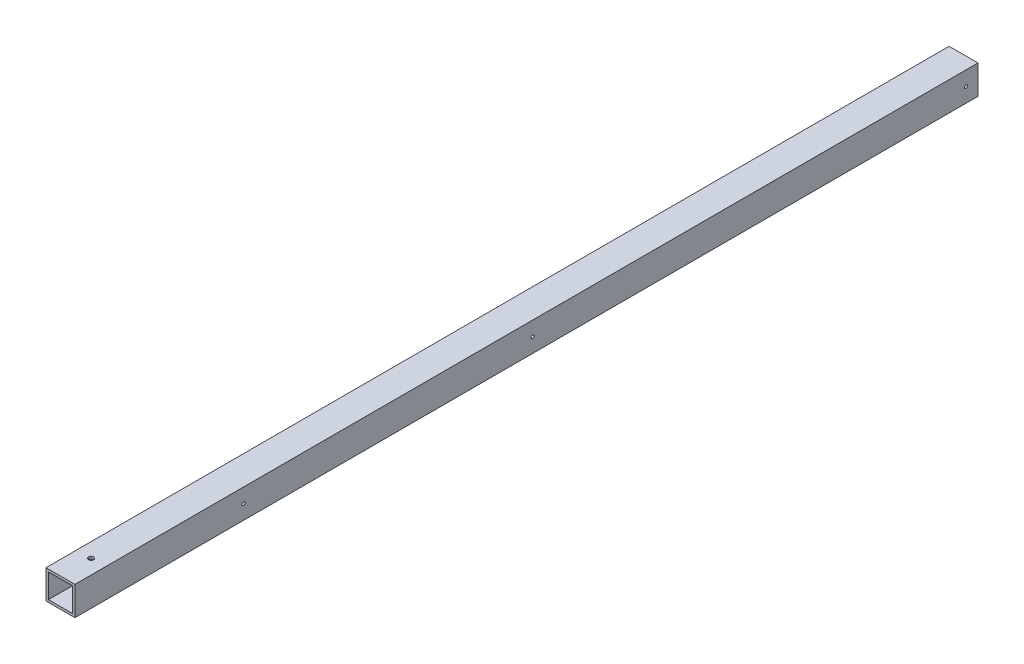
ISO-10303-21;
HEADER;
FILE_DESCRIPTION(('STEP AP214'),'2;1');
FILE_NAME('part.step','',(''),(''),'','','');
FILE_SCHEMA(('AUTOMOTIVE_DESIGN { 1 0 10303 214 1 1 1 1 }'));
ENDSEC;
DATA;
#1=APPLICATION_CONTEXT('core data for automotive mechanical design processes');
#2=APPLICATION_PROTOCOL_DEFINITION('international standard','automotive_design',2000,#1);
#3=PRODUCT_CONTEXT('',#1,'mechanical');
#4=PRODUCT('Part','Part','',(#3));
#5=PRODUCT_RELATED_PRODUCT_CATEGORY('part','',(#4));
#6=PRODUCT_DEFINITION_FORMATION('','',#4);
#7=PRODUCT_DEFINITION_CONTEXT('part definition',#1,'design');
#8=PRODUCT_DEFINITION('design','',#6,#7);
#9=PRODUCT_DEFINITION_SHAPE('','',#8);
#10=(LENGTH_UNIT() NAMED_UNIT(*) SI_UNIT(.MILLI.,.METRE.));
#11=(NAMED_UNIT(*) PLANE_ANGLE_UNIT() SI_UNIT($,.RADIAN.));
#12=(NAMED_UNIT(*) SI_UNIT($,.STERADIAN.) SOLID_ANGLE_UNIT());
#13=UNCERTAINTY_MEASURE_WITH_UNIT(LENGTH_MEASURE(1.E-05),#10,'distance_accuracy_value','');
#14=(GEOMETRIC_REPRESENTATION_CONTEXT(3) GLOBAL_UNCERTAINTY_ASSIGNED_CONTEXT((#13)) GLOBAL_UNIT_ASSIGNED_CONTEXT((#10,
#11,#12)) REPRESENTATION_CONTEXT('',''));
#15=CARTESIAN_POINT('',(0.,0.,0.));
#16=DIRECTION('',(0.,0.,1.));
#17=DIRECTION('',(1.,0.,0.));
#18=AXIS2_PLACEMENT_3D('',#15,#16,#17);
#19=CARTESIAN_POINT('',(0.,0.,375.));
#20=DIRECTION('',(0.,0.,1.));
#21=DIRECTION('',(1.,0.,0.));
#22=AXIS2_PLACEMENT_3D('',#19,#20,#21);
#23=PLANE('',#22);
#24=DIRECTION('',(0.,-1.,0.));
#25=VECTOR('',#24,1.);
#26=CARTESIAN_POINT('',(-12.,12.,375.));
#27=LINE('',#26,#25);
#28=CARTESIAN_POINT('',(-12.,12.,375.));
#29=VERTEX_POINT('',#28);
#30=CARTESIAN_POINT('',(-12.,-12.,375.));
#31=VERTEX_POINT('',#30);
#32=EDGE_CURVE('E140',#29,#31,#27,.T.);
#33=ORIENTED_EDGE('',*,*,#32,.T.);
#34=DIRECTION('',(1.,0.,0.));
#35=VECTOR('',#34,1.);
#36=CARTESIAN_POINT('',(-12.,-12.,375.));
#37=LINE('',#36,#35);
#38=CARTESIAN_POINT('',(12.,-12.,375.));
#39=VERTEX_POINT('',#38);
#40=EDGE_CURVE('E143',#31,#39,#37,.T.);
#41=ORIENTED_EDGE('',*,*,#40,.T.);
#42=DIRECTION('',(0.,1.,0.));
#43=VECTOR('',#42,1.);
#44=CARTESIAN_POINT('',(12.,12.,375.));
#45=LINE('',#44,#43);
#46=CARTESIAN_POINT('',(12.,12.,375.));
#47=VERTEX_POINT('',#46);
#48=EDGE_CURVE('E146',#39,#47,#45,.T.);
#49=ORIENTED_EDGE('',*,*,#48,.T.);
#50=DIRECTION('',(-1.,0.,0.));
#51=VECTOR('',#50,1.);
#52=CARTESIAN_POINT('',(-12.,12.,375.));
#53=LINE('',#52,#51);
#54=EDGE_CURVE('E148',#47,#29,#53,.T.);
#55=ORIENTED_EDGE('',*,*,#54,.T.);
#56=EDGE_LOOP('',(#33,#41,#49,#55));
#57=FACE_BOUND('',#56,.T.);
#58=DIRECTION('',(-1.,0.,0.));
#59=VECTOR('',#58,1.);
#60=CARTESIAN_POINT('',(-10.,10.,375.));
#61=LINE('',#60,#59);
#62=CARTESIAN_POINT('',(10.,10.,375.));
#63=VERTEX_POINT('',#62);
#64=CARTESIAN_POINT('',(-10.,10.,375.));
#65=VERTEX_POINT('',#64);
#66=EDGE_CURVE('E110',#63,#65,#61,.T.);
#67=ORIENTED_EDGE('',*,*,#66,.F.);
#68=DIRECTION('',(0.,1.,0.));
#69=VECTOR('',#68,1.);
#70=CARTESIAN_POINT('',(10.,10.,375.));
#71=LINE('',#70,#69);
#72=CARTESIAN_POINT('',(10.,-10.,375.));
#73=VERTEX_POINT('',#72);
#74=EDGE_CURVE('E102',#73,#63,#71,.T.);
#75=ORIENTED_EDGE('',*,*,#74,.F.);
#76=DIRECTION('',(1.,0.,0.));
#77=VECTOR('',#76,1.);
#78=CARTESIAN_POINT('',(-10.,-10.,375.));
#79=LINE('',#78,#77);
#80=CARTESIAN_POINT('',(-10.,-10.,375.));
#81=VERTEX_POINT('',#80);
#82=EDGE_CURVE('E124',#81,#73,#79,.T.);
#83=ORIENTED_EDGE('',*,*,#82,.F.);
#84=DIRECTION('',(0.,-1.,0.));
#85=VECTOR('',#84,1.);
#86=CARTESIAN_POINT('',(-10.,10.,375.));
#87=LINE('',#86,#85);
#88=EDGE_CURVE('E122',#65,#81,#87,.T.);
#89=ORIENTED_EDGE('',*,*,#88,.F.);
#90=EDGE_LOOP('',(#67,#75,#83,#89));
#91=FACE_BOUND('',#90,.T.);
#92=ADVANCED_FACE('F35',(#57,#91),#23,.T.);
#93=CARTESIAN_POINT('',(0.,0.,-375.));
#94=DIRECTION('',(0.,0.,1.));
#95=DIRECTION('',(1.,0.,0.));
#96=AXIS2_PLACEMENT_3D('',#93,#94,#95);
#97=PLANE('',#96);
#98=DIRECTION('',(0.,-1.,0.));
#99=VECTOR('',#98,1.);
#100=CARTESIAN_POINT('',(-12.,12.,-375.));
#101=LINE('',#100,#99);
#102=CARTESIAN_POINT('',(-12.,12.,-375.));
#103=VERTEX_POINT('',#102);
#104=CARTESIAN_POINT('',(-12.,-12.,-375.));
#105=VERTEX_POINT('',#104);
#106=EDGE_CURVE('E118',#103,#105,#101,.T.);
#107=ORIENTED_EDGE('',*,*,#106,.F.);
#108=DIRECTION('',(-1.,0.,0.));
#109=VECTOR('',#108,1.);
#110=CARTESIAN_POINT('',(-12.,12.,-375.));
#111=LINE('',#110,#109);
#112=CARTESIAN_POINT('',(12.,12.,-375.));
#113=VERTEX_POINT('',#112);
#114=EDGE_CURVE('E144',#113,#103,#111,.T.);
#115=ORIENTED_EDGE('',*,*,#114,.F.);
#116=DIRECTION('',(0.,1.,0.));
#117=VECTOR('',#116,1.);
#118=CARTESIAN_POINT('',(12.,12.,-375.));
#119=LINE('',#118,#117);
#120=CARTESIAN_POINT('',(12.,-12.,-375.));
#121=VERTEX_POINT('',#120);
#122=EDGE_CURVE('E155',#121,#113,#119,.T.);
#123=ORIENTED_EDGE('',*,*,#122,.F.);
#124=DIRECTION('',(1.,0.,0.));
#125=VECTOR('',#124,1.);
#126=CARTESIAN_POINT('',(-12.,-12.,-375.));
#127=LINE('',#126,#125);
#128=EDGE_CURVE('E153',#105,#121,#127,.T.);
#129=ORIENTED_EDGE('',*,*,#128,.F.);
#130=EDGE_LOOP('',(#107,#115,#123,#129));
#131=FACE_BOUND('',#130,.T.);
#132=DIRECTION('',(0.,1.,0.));
#133=VECTOR('',#132,1.);
#134=CARTESIAN_POINT('',(10.,10.,-375.));
#135=LINE('',#134,#133);
#136=CARTESIAN_POINT('',(10.,-10.,-375.));
#137=VERTEX_POINT('',#136);
#138=CARTESIAN_POINT('',(10.,10.,-375.));
#139=VERTEX_POINT('',#138);
#140=EDGE_CURVE('E60',#137,#139,#135,.T.);
#141=ORIENTED_EDGE('',*,*,#140,.T.);
#142=DIRECTION('',(-1.,0.,0.));
#143=VECTOR('',#142,1.);
#144=CARTESIAN_POINT('',(-10.,10.,-375.));
#145=LINE('',#144,#143);
#146=CARTESIAN_POINT('',(-10.,10.,-375.));
#147=VERTEX_POINT('',#146);
#148=EDGE_CURVE('E117',#139,#147,#145,.T.);
#149=ORIENTED_EDGE('',*,*,#148,.T.);
#150=DIRECTION('',(0.,-1.,0.));
#151=VECTOR('',#150,1.);
#152=CARTESIAN_POINT('',(-10.,10.,-375.));
#153=LINE('',#152,#151);
#154=CARTESIAN_POINT('',(-10.,-10.,-375.));
#155=VERTEX_POINT('',#154);
#156=EDGE_CURVE('E132',#147,#155,#153,.T.);
#157=ORIENTED_EDGE('',*,*,#156,.T.);
#158=DIRECTION('',(1.,0.,0.));
#159=VECTOR('',#158,1.);
#160=CARTESIAN_POINT('',(-10.,-10.,-375.));
#161=LINE('',#160,#159);
#162=EDGE_CURVE('E111',#155,#137,#161,.T.);
#163=ORIENTED_EDGE('',*,*,#162,.T.);
#164=EDGE_LOOP('',(#141,#149,#157,#163));
#165=FACE_BOUND('',#164,.T.);
#166=ADVANCED_FACE('F216',(#131,#165),#97,.F.);
#167=CARTESIAN_POINT('',(-12.,12.,375.));
#168=DIRECTION('',(1.,0.,0.));
#169=DIRECTION('',(0.,1.,0.));
#170=AXIS2_PLACEMENT_3D('',#167,#168,#169);
#171=PLANE('',#170);
#172=CARTESIAN_POINT('',(-12.,0.,-365.));
#173=DIRECTION('',(-1.,0.,0.));
#174=DIRECTION('',(0.,0.,1.));
#175=AXIS2_PLACEMENT_3D('',#172,#173,#174);
#176=CIRCLE('',#175,1.24999999999999);
#177=CARTESIAN_POINT('',(-12.,0.,-363.75));
#178=VERTEX_POINT('',#177);
#179=EDGE_CURVE('E285',#178,#178,#176,.T.);
#180=ORIENTED_EDGE('',*,*,#179,.F.);
#181=EDGE_LOOP('',(#180));
#182=FACE_BOUND('',#181,.T.);
#183=CARTESIAN_POINT('',(-12.,0.,-5.));
#184=DIRECTION('',(-1.,0.,0.));
#185=DIRECTION('',(0.,0.,1.));
#186=AXIS2_PLACEMENT_3D('',#183,#184,#185);
#187=CIRCLE('',#186,1.24999999999999);
#188=CARTESIAN_POINT('',(-12.,0.,-3.75000000000002));
#189=VERTEX_POINT('',#188);
#190=EDGE_CURVE('E178',#189,#189,#187,.T.);
#191=ORIENTED_EDGE('',*,*,#190,.F.);
#192=EDGE_LOOP('',(#191));
#193=FACE_BOUND('',#192,.T.);
#194=CARTESIAN_POINT('',(-12.,0.,235.));
#195=DIRECTION('',(-1.,0.,0.));
#196=DIRECTION('',(0.,0.,1.));
#197=AXIS2_PLACEMENT_3D('',#194,#195,#196);
#198=CIRCLE('',#197,1.24999999999999);
#199=CARTESIAN_POINT('',(-12.,0.,236.25));
#200=VERTEX_POINT('',#199);
#201=EDGE_CURVE('E175',#200,#200,#198,.T.);
#202=ORIENTED_EDGE('',*,*,#201,.F.);
#203=EDGE_LOOP('',(#202));
#204=FACE_BOUND('',#203,.T.);
#205=ORIENTED_EDGE('',*,*,#106,.T.);
#206=DIRECTION('',(0.,0.,-1.));
#207=VECTOR('',#206,1.);
#208=CARTESIAN_POINT('',(-12.,-12.,375.));
#209=LINE('',#208,#207);
#210=EDGE_CURVE('E11',#31,#105,#209,.T.);
#211=ORIENTED_EDGE('',*,*,#210,.F.);
#212=ORIENTED_EDGE('',*,*,#32,.F.);
#213=DIRECTION('',(0.,0.,-1.));
#214=VECTOR('',#213,1.);
#215=CARTESIAN_POINT('',(-12.,12.,375.));
#216=LINE('',#215,#214);
#217=EDGE_CURVE('E150',#29,#103,#216,.T.);
#218=ORIENTED_EDGE('',*,*,#217,.T.);
#219=EDGE_LOOP('',(#205,#211,#212,#218));
#220=FACE_BOUND('',#219,.T.);
#221=ADVANCED_FACE('F37',(#182,#193,#204,#220),#171,.F.);
#222=CARTESIAN_POINT('',(-12.,-12.,375.));
#223=DIRECTION('',(0.,1.,0.));
#224=DIRECTION('',(-1.,0.,0.));
#225=AXIS2_PLACEMENT_3D('',#222,#223,#224);
#226=PLANE('',#225);
#227=ORIENTED_EDGE('',*,*,#128,.T.);
#228=DIRECTION('',(0.,0.,-1.));
#229=VECTOR('',#228,1.);
#230=CARTESIAN_POINT('',(12.,-12.,375.));
#231=LINE('',#230,#229);
#232=EDGE_CURVE('E44',#39,#121,#231,.T.);
#233=ORIENTED_EDGE('',*,*,#232,.F.);
#234=ORIENTED_EDGE('',*,*,#40,.F.);
#235=ORIENTED_EDGE('',*,*,#210,.T.);
#236=EDGE_LOOP('',(#227,#233,#234,#235));
#237=FACE_BOUND('',#236,.T.);
#238=ADVANCED_FACE('F225',(#237),#226,.F.);
#239=CARTESIAN_POINT('',(12.,12.,375.));
#240=DIRECTION('',(-1.,0.,0.));
#241=DIRECTION('',(0.,-1.,0.));
#242=AXIS2_PLACEMENT_3D('',#239,#240,#241);
#243=PLANE('',#242);
#244=CARTESIAN_POINT('',(12.,0.,-365.));
#245=DIRECTION('',(-1.,0.,0.));
#246=DIRECTION('',(0.,0.,1.));
#247=AXIS2_PLACEMENT_3D('',#244,#245,#246);
#248=CIRCLE('',#247,1.24999999999998);
#249=CARTESIAN_POINT('',(12.,0.,-363.75));
#250=VERTEX_POINT('',#249);
#251=EDGE_CURVE('E290',#250,#250,#248,.T.);
#252=ORIENTED_EDGE('',*,*,#251,.T.);
#253=EDGE_LOOP('',(#252));
#254=FACE_BOUND('',#253,.T.);
#255=CARTESIAN_POINT('',(12.,0.,-5.));
#256=DIRECTION('',(-1.,0.,0.));
#257=DIRECTION('',(0.,0.,1.));
#258=AXIS2_PLACEMENT_3D('',#255,#256,#257);
#259=CIRCLE('',#258,1.24999999999998);
#260=CARTESIAN_POINT('',(12.,0.,-3.75000000000002));
#261=VERTEX_POINT('',#260);
#262=EDGE_CURVE('E171',#261,#261,#259,.T.);
#263=ORIENTED_EDGE('',*,*,#262,.T.);
#264=EDGE_LOOP('',(#263));
#265=FACE_BOUND('',#264,.T.);
#266=CARTESIAN_POINT('',(12.,0.,235.));
#267=DIRECTION('',(-1.,0.,0.));
#268=DIRECTION('',(0.,0.,1.));
#269=AXIS2_PLACEMENT_3D('',#266,#267,#268);
#270=CIRCLE('',#269,1.24999999999998);
#271=CARTESIAN_POINT('',(12.,0.,236.25));
#272=VERTEX_POINT('',#271);
#273=EDGE_CURVE('E167',#272,#272,#270,.T.);
#274=ORIENTED_EDGE('',*,*,#273,.T.);
#275=EDGE_LOOP('',(#274));
#276=FACE_BOUND('',#275,.T.);
#277=ORIENTED_EDGE('',*,*,#122,.T.);
#278=DIRECTION('',(0.,0.,-1.));
#279=VECTOR('',#278,1.);
#280=CARTESIAN_POINT('',(12.,12.,375.));
#281=LINE('',#280,#279);
#282=EDGE_CURVE('E160',#47,#113,#281,.T.);
#283=ORIENTED_EDGE('',*,*,#282,.F.);
#284=ORIENTED_EDGE('',*,*,#48,.F.);
#285=ORIENTED_EDGE('',*,*,#232,.T.);
#286=EDGE_LOOP('',(#277,#283,#284,#285));
#287=FACE_BOUND('',#286,.T.);
#288=ADVANCED_FACE('F209',(#254,#265,#276,#287),#243,.F.);
#289=CARTESIAN_POINT('',(-12.,12.,375.));
#290=DIRECTION('',(0.,-1.,0.));
#291=DIRECTION('',(0.,0.,-1.));
#292=AXIS2_PLACEMENT_3D('',#289,#290,#291);
#293=PLANE('',#292);
#294=CARTESIAN_POINT('',(0.,12.,349.5));
#295=DIRECTION('',(0.,1.,0.));
#296=DIRECTION('',(0.,0.,1.));
#297=AXIS2_PLACEMENT_3D('',#294,#295,#296);
#298=CIRCLE('',#297,2.1);
#299=CARTESIAN_POINT('',(0.,12.,351.6));
#300=VERTEX_POINT('',#299);
#301=EDGE_CURVE('E283',#300,#300,#298,.T.);
#302=ORIENTED_EDGE('',*,*,#301,.F.);
#303=EDGE_LOOP('',(#302));
#304=FACE_BOUND('',#303,.T.);
#305=ORIENTED_EDGE('',*,*,#114,.T.);
#306=ORIENTED_EDGE('',*,*,#217,.F.);
#307=ORIENTED_EDGE('',*,*,#54,.F.);
#308=ORIENTED_EDGE('',*,*,#282,.T.);
#309=EDGE_LOOP('',(#305,#306,#307,#308));
#310=FACE_BOUND('',#309,.T.);
#311=ADVANCED_FACE('F197',(#304,#310),#293,.F.);
#312=CARTESIAN_POINT('',(10.,10.,375.));
#313=DIRECTION('',(-1.,0.,0.));
#314=DIRECTION('',(0.,0.,1.));
#315=AXIS2_PLACEMENT_3D('',#312,#313,#314);
#316=PLANE('',#315);
#317=CARTESIAN_POINT('',(10.,0.,-365.));
#318=DIRECTION('',(-1.,0.,0.));
#319=DIRECTION('',(0.,0.,1.));
#320=AXIS2_PLACEMENT_3D('',#317,#318,#319);
#321=CIRCLE('',#320,1.24999999999999);
#322=CARTESIAN_POINT('',(10.,0.,-363.75));
#323=VERTEX_POINT('',#322);
#324=EDGE_CURVE('E183',#323,#323,#321,.T.);
#325=ORIENTED_EDGE('',*,*,#324,.F.);
#326=EDGE_LOOP('',(#325));
#327=FACE_BOUND('',#326,.T.);
#328=CARTESIAN_POINT('',(10.,0.,-5.));
#329=DIRECTION('',(-1.,0.,0.));
#330=DIRECTION('',(0.,0.,1.));
#331=AXIS2_PLACEMENT_3D('',#328,#329,#330);
#332=CIRCLE('',#331,1.24999999999999);
#333=CARTESIAN_POINT('',(10.,0.,-3.75000000000002));
#334=VERTEX_POINT('',#333);
#335=EDGE_CURVE('E170',#334,#334,#332,.T.);
#336=ORIENTED_EDGE('',*,*,#335,.F.);
#337=EDGE_LOOP('',(#336));
#338=FACE_BOUND('',#337,.T.);
#339=CARTESIAN_POINT('',(10.,0.,235.));
#340=DIRECTION('',(-1.,0.,0.));
#341=DIRECTION('',(0.,0.,1.));
#342=AXIS2_PLACEMENT_3D('',#339,#340,#341);
#343=CIRCLE('',#342,1.24999999999999);
#344=CARTESIAN_POINT('',(10.,0.,236.25));
#345=VERTEX_POINT('',#344);
#346=EDGE_CURVE('E130',#345,#345,#343,.T.);
#347=ORIENTED_EDGE('',*,*,#346,.F.);
#348=EDGE_LOOP('',(#347));
#349=FACE_BOUND('',#348,.T.);
#350=ORIENTED_EDGE('',*,*,#140,.F.);
#351=DIRECTION('',(0.,0.,-1.));
#352=VECTOR('',#351,1.);
#353=CARTESIAN_POINT('',(10.,-10.,375.));
#354=LINE('',#353,#352);
#355=EDGE_CURVE('E106',#73,#137,#354,.T.);
#356=ORIENTED_EDGE('',*,*,#355,.F.);
#357=ORIENTED_EDGE('',*,*,#74,.T.);
#358=DIRECTION('',(0.,0.,-1.));
#359=VECTOR('',#358,1.);
#360=CARTESIAN_POINT('',(10.,10.,375.));
#361=LINE('',#360,#359);
#362=EDGE_CURVE('E105',#63,#139,#361,.T.);
#363=ORIENTED_EDGE('',*,*,#362,.T.);
#364=EDGE_LOOP('',(#350,#356,#357,#363));
#365=FACE_BOUND('',#364,.T.);
#366=ADVANCED_FACE('F104',(#327,#338,#349,#365),#316,.T.);
#367=CARTESIAN_POINT('',(-10.,10.,375.));
#368=DIRECTION('',(0.,-1.,0.));
#369=DIRECTION('',(0.,0.,-1.));
#370=AXIS2_PLACEMENT_3D('',#367,#368,#369);
#371=PLANE('',#370);
#372=CARTESIAN_POINT('',(0.,10.,349.5));
#373=DIRECTION('',(0.,-1.,0.));
#374=DIRECTION('',(0.,0.,-1.));
#375=AXIS2_PLACEMENT_3D('',#372,#373,#374);
#376=CIRCLE('',#375,2.1);
#377=CARTESIAN_POINT('',(0.,10.,347.4));
#378=VERTEX_POINT('',#377);
#379=EDGE_CURVE('E280',#378,#378,#376,.T.);
#380=ORIENTED_EDGE('',*,*,#379,.F.);
#381=EDGE_LOOP('',(#380));
#382=FACE_BOUND('',#381,.T.);
#383=ORIENTED_EDGE('',*,*,#148,.F.);
#384=ORIENTED_EDGE('',*,*,#362,.F.);
#385=ORIENTED_EDGE('',*,*,#66,.T.);
#386=DIRECTION('',(0.,0.,-1.));
#387=VECTOR('',#386,1.);
#388=CARTESIAN_POINT('',(-10.,10.,375.));
#389=LINE('',#388,#387);
#390=EDGE_CURVE('E119',#65,#147,#389,.T.);
#391=ORIENTED_EDGE('',*,*,#390,.T.);
#392=EDGE_LOOP('',(#383,#384,#385,#391));
#393=FACE_BOUND('',#392,.T.);
#394=ADVANCED_FACE('F114',(#382,#393),#371,.T.);
#395=CARTESIAN_POINT('',(-10.,10.,375.));
#396=DIRECTION('',(1.,0.,0.));
#397=DIRECTION('',(0.,1.,0.));
#398=AXIS2_PLACEMENT_3D('',#395,#396,#397);
#399=PLANE('',#398);
#400=CARTESIAN_POINT('',(-10.,0.,-365.));
#401=DIRECTION('',(1.,0.,0.));
#402=DIRECTION('',(0.,1.,0.));
#403=AXIS2_PLACEMENT_3D('',#400,#401,#402);
#404=CIRCLE('',#403,1.24999999999999);
#405=CARTESIAN_POINT('',(-10.,1.24999999999998,-365.));
#406=VERTEX_POINT('',#405);
#407=EDGE_CURVE('E39',#406,#406,#404,.T.);
#408=ORIENTED_EDGE('',*,*,#407,.F.);
#409=EDGE_LOOP('',(#408));
#410=FACE_BOUND('',#409,.T.);
#411=CARTESIAN_POINT('',(-10.,0.,-5.));
#412=DIRECTION('',(1.,0.,0.));
#413=DIRECTION('',(0.,1.,0.));
#414=AXIS2_PLACEMENT_3D('',#411,#412,#413);
#415=CIRCLE('',#414,1.24999999999999);
#416=CARTESIAN_POINT('',(-10.,1.24999999999998,-5.));
#417=VERTEX_POINT('',#416);
#418=EDGE_CURVE('E168',#417,#417,#415,.T.);
#419=ORIENTED_EDGE('',*,*,#418,.F.);
#420=EDGE_LOOP('',(#419));
#421=FACE_BOUND('',#420,.T.);
#422=CARTESIAN_POINT('',(-10.,0.,235.));
#423=DIRECTION('',(1.,0.,0.));
#424=DIRECTION('',(0.,1.,0.));
#425=AXIS2_PLACEMENT_3D('',#422,#423,#424);
#426=CIRCLE('',#425,1.24999999999999);
#427=CARTESIAN_POINT('',(-10.,1.24999999999998,235.));
#428=VERTEX_POINT('',#427);
#429=EDGE_CURVE('E165',#428,#428,#426,.T.);
#430=ORIENTED_EDGE('',*,*,#429,.F.);
#431=EDGE_LOOP('',(#430));
#432=FACE_BOUND('',#431,.T.);
#433=ORIENTED_EDGE('',*,*,#156,.F.);
#434=ORIENTED_EDGE('',*,*,#390,.F.);
#435=ORIENTED_EDGE('',*,*,#88,.T.);
#436=DIRECTION('',(0.,0.,-1.));
#437=VECTOR('',#436,1.);
#438=CARTESIAN_POINT('',(-10.,-10.,375.));
#439=LINE('',#438,#437);
#440=EDGE_CURVE('E52',#81,#155,#439,.T.);
#441=ORIENTED_EDGE('',*,*,#440,.T.);
#442=EDGE_LOOP('',(#433,#434,#435,#441));
#443=FACE_BOUND('',#442,.T.);
#444=ADVANCED_FACE('F205',(#410,#421,#432,#443),#399,.T.);
#445=CARTESIAN_POINT('',(-10.,-10.,375.));
#446=DIRECTION('',(0.,1.,0.));
#447=DIRECTION('',(0.,0.,1.));
#448=AXIS2_PLACEMENT_3D('',#445,#446,#447);
#449=PLANE('',#448);
#450=ORIENTED_EDGE('',*,*,#162,.F.);
#451=ORIENTED_EDGE('',*,*,#440,.F.);
#452=ORIENTED_EDGE('',*,*,#82,.T.);
#453=ORIENTED_EDGE('',*,*,#355,.T.);
#454=EDGE_LOOP('',(#450,#451,#452,#453));
#455=FACE_BOUND('',#454,.T.);
#456=ADVANCED_FACE('F248',(#455),#449,.T.);
#457=CARTESIAN_POINT('',(-12.,0.,235.));
#458=DIRECTION('',(-1.,0.,0.));
#459=DIRECTION('',(0.,0.,1.));
#460=AXIS2_PLACEMENT_3D('',#457,#458,#459);
#461=CYLINDRICAL_SURFACE('',#460,1.24999999999999);
#462=ORIENTED_EDGE('',*,*,#429,.T.);
#463=EDGE_LOOP('',(#462));
#464=FACE_BOUND('',#463,.T.);
#465=ORIENTED_EDGE('',*,*,#201,.T.);
#466=EDGE_LOOP('',(#465));
#467=FACE_BOUND('',#466,.T.);
#468=ADVANCED_FACE('F250',(#464,#467),#461,.F.);
#469=ORIENTED_EDGE('',*,*,#346,.T.);
#470=EDGE_LOOP('',(#469));
#471=FACE_BOUND('',#470,.T.);
#472=ORIENTED_EDGE('',*,*,#273,.F.);
#473=EDGE_LOOP('',(#472));
#474=FACE_BOUND('',#473,.T.);
#475=ADVANCED_FACE('F193',(#471,#474),#461,.F.);
#476=CARTESIAN_POINT('',(-12.,0.,-5.));
#477=DIRECTION('',(-1.,0.,0.));
#478=DIRECTION('',(0.,0.,1.));
#479=AXIS2_PLACEMENT_3D('',#476,#477,#478);
#480=CYLINDRICAL_SURFACE('',#479,1.24999999999999);
#481=ORIENTED_EDGE('',*,*,#418,.T.);
#482=EDGE_LOOP('',(#481));
#483=FACE_BOUND('',#482,.T.);
#484=ORIENTED_EDGE('',*,*,#190,.T.);
#485=EDGE_LOOP('',(#484));
#486=FACE_BOUND('',#485,.T.);
#487=ADVANCED_FACE('F261',(#483,#486),#480,.F.);
#488=ORIENTED_EDGE('',*,*,#335,.T.);
#489=EDGE_LOOP('',(#488));
#490=FACE_BOUND('',#489,.T.);
#491=ORIENTED_EDGE('',*,*,#262,.F.);
#492=EDGE_LOOP('',(#491));
#493=FACE_BOUND('',#492,.T.);
#494=ADVANCED_FACE('F264',(#490,#493),#480,.F.);
#495=CARTESIAN_POINT('',(-12.,0.,-365.));
#496=DIRECTION('',(-1.,0.,0.));
#497=DIRECTION('',(0.,0.,1.));
#498=AXIS2_PLACEMENT_3D('',#495,#496,#497);
#499=CYLINDRICAL_SURFACE('',#498,1.24999999999999);
#500=ORIENTED_EDGE('',*,*,#407,.T.);
#501=EDGE_LOOP('',(#500));
#502=FACE_BOUND('',#501,.T.);
#503=ORIENTED_EDGE('',*,*,#179,.T.);
#504=EDGE_LOOP('',(#503));
#505=FACE_BOUND('',#504,.T.);
#506=ADVANCED_FACE('F265',(#502,#505),#499,.F.);
#507=ORIENTED_EDGE('',*,*,#324,.T.);
#508=EDGE_LOOP('',(#507));
#509=FACE_BOUND('',#508,.T.);
#510=ORIENTED_EDGE('',*,*,#251,.F.);
#511=EDGE_LOOP('',(#510));
#512=FACE_BOUND('',#511,.T.);
#513=ADVANCED_FACE('F268',(#509,#512),#499,.F.);
#514=CARTESIAN_POINT('',(0.,12.,349.5));
#515=DIRECTION('',(0.,1.,0.));
#516=DIRECTION('',(0.,0.,1.));
#517=AXIS2_PLACEMENT_3D('',#514,#515,#516);
#518=CYLINDRICAL_SURFACE('',#517,2.1);
#519=ORIENTED_EDGE('',*,*,#379,.T.);
#520=EDGE_LOOP('',(#519));
#521=FACE_BOUND('',#520,.T.);
#522=ORIENTED_EDGE('',*,*,#301,.T.);
#523=EDGE_LOOP('',(#522));
#524=FACE_BOUND('',#523,.T.);
#525=ADVANCED_FACE('F270',(#521,#524),#518,.F.);
#526=CLOSED_SHELL('',(#92,#166,#221,#238,#288,#311,#366,#394,#444,#456,#468,#475,#487,#494,#506,
#513,#525));
#527=MANIFOLD_SOLID_BREP('B2',#526);
#528=ADVANCED_BREP_SHAPE_REPRESENTATION('',(#18,#527),#14);
#529=SHAPE_DEFINITION_REPRESENTATION(#9,#528);
ENDSEC;
END-ISO-10303-21;
